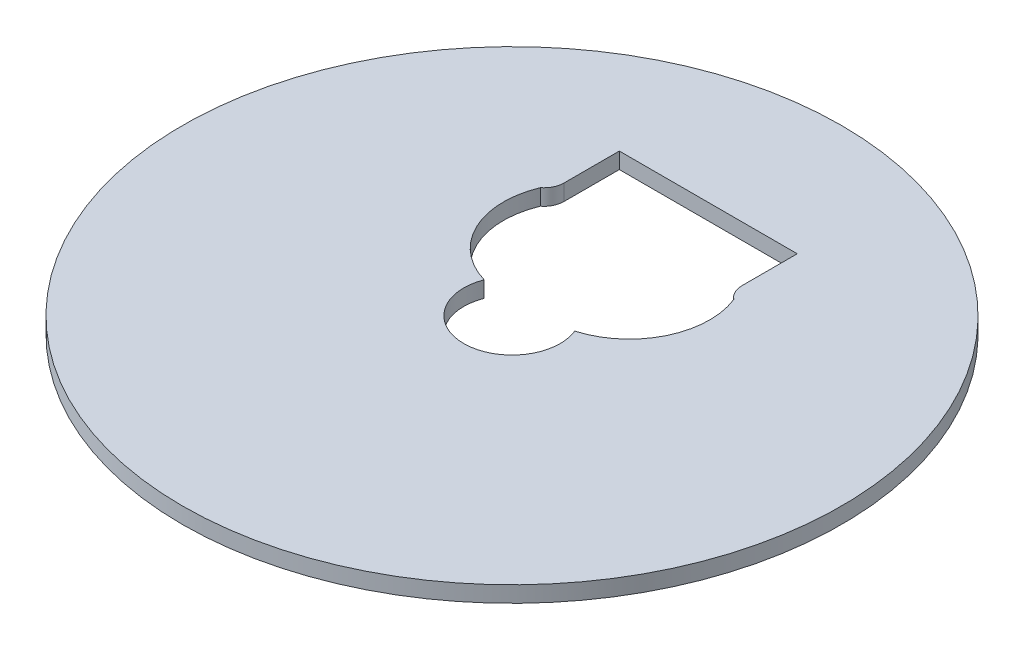
ISO-10303-21;
HEADER;
FILE_DESCRIPTION(('STEP AP214'),'2;1');
FILE_NAME('part.step','',(''),(''),'','','');
FILE_SCHEMA(('AUTOMOTIVE_DESIGN { 1 0 10303 214 1 1 1 1 }'));
ENDSEC;
DATA;
#1=APPLICATION_CONTEXT('core data for automotive mechanical design processes');
#2=APPLICATION_PROTOCOL_DEFINITION('international standard','automotive_design',2000,#1);
#3=PRODUCT_CONTEXT('',#1,'mechanical');
#4=PRODUCT('Part','Part','',(#3));
#5=PRODUCT_RELATED_PRODUCT_CATEGORY('part','',(#4));
#6=PRODUCT_DEFINITION_FORMATION('','',#4);
#7=PRODUCT_DEFINITION_CONTEXT('part definition',#1,'design');
#8=PRODUCT_DEFINITION('design','',#6,#7);
#9=PRODUCT_DEFINITION_SHAPE('','',#8);
#10=(LENGTH_UNIT() NAMED_UNIT(*) SI_UNIT(.MILLI.,.METRE.));
#11=(NAMED_UNIT(*) PLANE_ANGLE_UNIT() SI_UNIT($,.RADIAN.));
#12=(NAMED_UNIT(*) SI_UNIT($,.STERADIAN.) SOLID_ANGLE_UNIT());
#13=UNCERTAINTY_MEASURE_WITH_UNIT(LENGTH_MEASURE(1.E-05),#10,'distance_accuracy_value','');
#14=(GEOMETRIC_REPRESENTATION_CONTEXT(3) GLOBAL_UNCERTAINTY_ASSIGNED_CONTEXT((#13)) GLOBAL_UNIT_ASSIGNED_CONTEXT((#10,
#11,#12)) REPRESENTATION_CONTEXT('',''));
#15=CARTESIAN_POINT('',(0.,0.,0.));
#16=DIRECTION('',(0.,0.,1.));
#17=DIRECTION('',(1.,0.,0.));
#18=AXIS2_PLACEMENT_3D('',#15,#16,#17);
#19=CARTESIAN_POINT('',(-2.53823054176068,2.,-13.7740242069911));
#20=DIRECTION('',(0.,-1.,0.));
#21=DIRECTION('',(0.,0.,-1.));
#22=AXIS2_PLACEMENT_3D('',#19,#20,#21);
#23=CYLINDRICAL_SURFACE('',#22,10.);
#24=CARTESIAN_POINT('',(-2.53823054176068,0.,-13.7740242069911));
#25=DIRECTION('',(0.,1.,0.));
#26=DIRECTION('',(0.,0.,1.));
#27=AXIS2_PLACEMENT_3D('',#24,#25,#26);
#28=CIRCLE('',#27,10.);
#29=CARTESIAN_POINT('',(-5.34780218614919,0.,-4.17682111572293));
#30=VERTEX_POINT('',#29);
#31=CARTESIAN_POINT('',(-11.7774510508071,0.,-17.5998332982532));
#32=VERTEX_POINT('',#31);
#33=EDGE_CURVE('E154',#30,#32,#28,.F.);
#34=ORIENTED_EDGE('',*,*,#33,.T.);
#35=DIRECTION('',(0.,-1.,0.));
#36=VECTOR('',#35,1.);
#37=CARTESIAN_POINT('',(-11.7774510508071,2.,-17.5998332982532));
#38=LINE('',#37,#36);
#39=CARTESIAN_POINT('',(-11.7774510508071,2.,-17.5998332982532));
#40=VERTEX_POINT('',#39);
#41=EDGE_CURVE('E11',#40,#32,#38,.T.);
#42=ORIENTED_EDGE('',*,*,#41,.F.);
#43=CARTESIAN_POINT('',(-2.53823054176068,2.,-13.7740242069911));
#44=DIRECTION('',(0.,1.,0.));
#45=DIRECTION('',(0.,0.,1.));
#46=AXIS2_PLACEMENT_3D('',#43,#44,#45);
#47=CIRCLE('',#46,10.);
#48=CARTESIAN_POINT('',(-5.34780218614919,2.,-4.17682111572293));
#49=VERTEX_POINT('',#48);
#50=EDGE_CURVE('E101',#49,#40,#47,.F.);
#51=ORIENTED_EDGE('',*,*,#50,.F.);
#52=DIRECTION('',(0.,-1.,0.));
#53=VECTOR('',#52,1.);
#54=CARTESIAN_POINT('',(-5.34780218614919,2.,-4.17682111572293));
#55=LINE('',#54,#53);
#56=EDGE_CURVE('E63',#49,#30,#55,.T.);
#57=ORIENTED_EDGE('',*,*,#56,.T.);
#58=EDGE_LOOP('',(#34,#42,#51,#57));
#59=FACE_BOUND('',#58,.T.);
#60=ADVANCED_FACE('F46',(#59),#23,.F.);
#61=CARTESIAN_POINT('',(-13.3089978154866,2.,-19.5757805702824));
#62=DIRECTION('',(0.,-1.,0.));
#63=DIRECTION('',(0.,0.,-1.));
#64=AXIS2_PLACEMENT_3D('',#61,#62,#63);
#65=CYLINDRICAL_SURFACE('',#64,2.5);
#66=CARTESIAN_POINT('',(-13.3089978154866,0.,-19.5757805702824));
#67=DIRECTION('',(0.,1.,0.));
#68=DIRECTION('',(0.,0.,1.));
#69=AXIS2_PLACEMENT_3D('',#66,#67,#68);
#70=CIRCLE('',#69,2.5);
#71=CARTESIAN_POINT('',(-10.8089978154866,0.,-19.5757805702824));
#72=VERTEX_POINT('',#71);
#73=EDGE_CURVE('E157',#72,#32,#70,.F.);
#74=ORIENTED_EDGE('',*,*,#73,.F.);
#75=DIRECTION('',(0.,-1.,0.));
#76=VECTOR('',#75,1.);
#77=CARTESIAN_POINT('',(-10.8089978154866,2.,-19.5757805702824));
#78=LINE('',#77,#76);
#79=CARTESIAN_POINT('',(-10.8089978154866,2.,-19.5757805702824));
#80=VERTEX_POINT('',#79);
#81=EDGE_CURVE('E55',#80,#72,#78,.T.);
#82=ORIENTED_EDGE('',*,*,#81,.F.);
#83=CARTESIAN_POINT('',(-13.3089978154866,2.,-19.5757805702824));
#84=DIRECTION('',(0.,1.,0.));
#85=DIRECTION('',(0.,0.,1.));
#86=AXIS2_PLACEMENT_3D('',#83,#84,#85);
#87=CIRCLE('',#86,2.5);
#88=EDGE_CURVE('E226',#80,#40,#87,.F.);
#89=ORIENTED_EDGE('',*,*,#88,.T.);
#90=ORIENTED_EDGE('',*,*,#41,.T.);
#91=EDGE_LOOP('',(#74,#82,#89,#90));
#92=FACE_BOUND('',#91,.T.);
#93=ADVANCED_FACE('F207',(#92),#65,.T.);
#94=CARTESIAN_POINT('',(-10.8089978154866,2.,0.));
#95=DIRECTION('',(1.,0.,0.));
#96=DIRECTION('',(0.,0.,-1.));
#97=AXIS2_PLACEMENT_3D('',#94,#95,#96);
#98=PLANE('',#97);
#99=DIRECTION('',(0.,0.,1.));
#100=VECTOR('',#99,1.);
#101=CARTESIAN_POINT('',(-10.8089978154866,0.,0.));
#102=LINE('',#101,#100);
#103=CARTESIAN_POINT('',(-10.8089978154866,0.,-26.4576247573257));
#104=VERTEX_POINT('',#103);
#105=EDGE_CURVE('E161',#104,#72,#102,.T.);
#106=ORIENTED_EDGE('',*,*,#105,.F.);
#107=DIRECTION('',(0.,-1.,0.));
#108=VECTOR('',#107,1.);
#109=CARTESIAN_POINT('',(-10.8089978154866,2.,-26.4576247573257));
#110=LINE('',#109,#108);
#111=CARTESIAN_POINT('',(-10.8089978154866,2.,-26.4576247573257));
#112=VERTEX_POINT('',#111);
#113=EDGE_CURVE('E193',#112,#104,#110,.T.);
#114=ORIENTED_EDGE('',*,*,#113,.F.);
#115=DIRECTION('',(0.,0.,1.));
#116=VECTOR('',#115,1.);
#117=CARTESIAN_POINT('',(-10.8089978154866,2.,0.));
#118=LINE('',#117,#116);
#119=EDGE_CURVE('E204',#112,#80,#118,.T.);
#120=ORIENTED_EDGE('',*,*,#119,.T.);
#121=ORIENTED_EDGE('',*,*,#81,.T.);
#122=EDGE_LOOP('',(#106,#114,#120,#121));
#123=FACE_BOUND('',#122,.T.);
#124=ADVANCED_FACE('F202',(#123),#98,.T.);
#125=CARTESIAN_POINT('',(0.,2.,-26.4576247573257));
#126=DIRECTION('',(0.,0.,-1.));
#127=DIRECTION('',(-1.,0.,0.));
#128=AXIS2_PLACEMENT_3D('',#125,#126,#127);
#129=PLANE('',#128);
#130=DIRECTION('',(1.,0.,0.));
#131=VECTOR('',#130,1.);
#132=CARTESIAN_POINT('',(0.,0.,-26.4576247573257));
#133=LINE('',#132,#131);
#134=CARTESIAN_POINT('',(11.3250938001878,0.,-26.4576247573257));
#135=VERTEX_POINT('',#134);
#136=EDGE_CURVE('E165',#104,#135,#133,.T.);
#137=ORIENTED_EDGE('',*,*,#136,.T.);
#138=DIRECTION('',(0.,-1.,0.));
#139=VECTOR('',#138,1.);
#140=CARTESIAN_POINT('',(11.3250938001878,2.,-26.4576247573257));
#141=LINE('',#140,#139);
#142=CARTESIAN_POINT('',(11.3250938001878,2.,-26.4576247573257));
#143=VERTEX_POINT('',#142);
#144=EDGE_CURVE('E189',#143,#135,#141,.T.);
#145=ORIENTED_EDGE('',*,*,#144,.F.);
#146=DIRECTION('',(1.,0.,0.));
#147=VECTOR('',#146,1.);
#148=CARTESIAN_POINT('',(0.,2.,-26.4576247573257));
#149=LINE('',#148,#147);
#150=EDGE_CURVE('E220',#112,#143,#149,.T.);
#151=ORIENTED_EDGE('',*,*,#150,.F.);
#152=ORIENTED_EDGE('',*,*,#113,.T.);
#153=EDGE_LOOP('',(#137,#145,#151,#152));
#154=FACE_BOUND('',#153,.T.);
#155=ADVANCED_FACE('F215',(#154),#129,.F.);
#156=CARTESIAN_POINT('',(11.3250938001878,2.,0.));
#157=DIRECTION('',(1.,0.,0.));
#158=DIRECTION('',(0.,0.,-1.));
#159=AXIS2_PLACEMENT_3D('',#156,#157,#158);
#160=PLANE('',#159);
#161=DIRECTION('',(0.,0.,1.));
#162=VECTOR('',#161,1.);
#163=CARTESIAN_POINT('',(11.3250938001878,0.,0.));
#164=LINE('',#163,#162);
#165=CARTESIAN_POINT('',(11.3250938001878,0.,-19.5757805702824));
#166=VERTEX_POINT('',#165);
#167=EDGE_CURVE('E168',#135,#166,#164,.T.);
#168=ORIENTED_EDGE('',*,*,#167,.T.);
#169=DIRECTION('',(0.,-1.,0.));
#170=VECTOR('',#169,1.);
#171=CARTESIAN_POINT('',(11.3250938001878,2.,-19.5757805702824));
#172=LINE('',#171,#170);
#173=CARTESIAN_POINT('',(11.3250938001878,2.,-19.5757805702824));
#174=VERTEX_POINT('',#173);
#175=EDGE_CURVE('E137',#174,#166,#172,.T.);
#176=ORIENTED_EDGE('',*,*,#175,.F.);
#177=DIRECTION('',(0.,0.,1.));
#178=VECTOR('',#177,1.);
#179=CARTESIAN_POINT('',(11.3250938001878,2.,0.));
#180=LINE('',#179,#178);
#181=EDGE_CURVE('E123',#143,#174,#180,.T.);
#182=ORIENTED_EDGE('',*,*,#181,.F.);
#183=ORIENTED_EDGE('',*,*,#144,.T.);
#184=EDGE_LOOP('',(#168,#176,#182,#183));
#185=FACE_BOUND('',#184,.T.);
#186=ADVANCED_FACE('F218',(#185),#160,.F.);
#187=CARTESIAN_POINT('',(13.8250938001878,2.,-19.5757805702824));
#188=DIRECTION('',(0.,-1.,0.));
#189=DIRECTION('',(0.,0.,-1.));
#190=AXIS2_PLACEMENT_3D('',#187,#188,#189);
#191=CYLINDRICAL_SURFACE('',#190,2.5);
#192=CARTESIAN_POINT('',(13.8250938001878,0.,-19.5757805702824));
#193=DIRECTION('',(0.,1.,0.));
#194=DIRECTION('',(0.,0.,1.));
#195=AXIS2_PLACEMENT_3D('',#192,#193,#194);
#196=CIRCLE('',#195,2.5);
#197=CARTESIAN_POINT('',(12.2954061083367,0.,-17.5983945266886));
#198=VERTEX_POINT('',#197);
#199=EDGE_CURVE('E133',#166,#198,#196,.T.);
#200=ORIENTED_EDGE('',*,*,#199,.T.);
#201=DIRECTION('',(0.,-1.,0.));
#202=VECTOR('',#201,1.);
#203=CARTESIAN_POINT('',(12.2954061083367,2.,-17.5983945266886));
#204=LINE('',#203,#202);
#205=CARTESIAN_POINT('',(12.2954061083367,2.,-17.5983945266886));
#206=VERTEX_POINT('',#205);
#207=EDGE_CURVE('E130',#206,#198,#204,.T.);
#208=ORIENTED_EDGE('',*,*,#207,.F.);
#209=CARTESIAN_POINT('',(13.8250938001878,2.,-19.5757805702824));
#210=DIRECTION('',(0.,1.,0.));
#211=DIRECTION('',(0.,0.,1.));
#212=AXIS2_PLACEMENT_3D('',#209,#210,#211);
#213=CIRCLE('',#212,2.5);
#214=EDGE_CURVE('E116',#174,#206,#213,.T.);
#215=ORIENTED_EDGE('',*,*,#214,.F.);
#216=ORIENTED_EDGE('',*,*,#175,.T.);
#217=EDGE_LOOP('',(#200,#208,#215,#216));
#218=FACE_BOUND('',#217,.T.);
#219=ADVANCED_FACE('F131',(#218),#191,.T.);
#220=CARTESIAN_POINT('',(3.01205565123249,2.,-13.8809485902179));
#221=DIRECTION('',(0.,-1.,0.));
#222=DIRECTION('',(0.,0.,-1.));
#223=AXIS2_PLACEMENT_3D('',#220,#221,#222);
#224=CYLINDRICAL_SURFACE('',#223,10.);
#225=CARTESIAN_POINT('',(3.01205565123249,0.,-13.8809485902179));
#226=DIRECTION('',(0.,1.,0.));
#227=DIRECTION('',(0.,0.,1.));
#228=AXIS2_PLACEMENT_3D('',#225,#226,#227);
#229=CIRCLE('',#228,10.);
#230=CARTESIAN_POINT('',(5.82189493551418,0.,-4.2838238543135));
#231=VERTEX_POINT('',#230);
#232=EDGE_CURVE('E173',#198,#231,#229,.F.);
#233=ORIENTED_EDGE('',*,*,#232,.T.);
#234=DIRECTION('',(0.,-1.,0.));
#235=VECTOR('',#234,1.);
#236=CARTESIAN_POINT('',(5.82189493551418,2.,-4.2838238543135));
#237=LINE('',#236,#235);
#238=CARTESIAN_POINT('',(5.82189493551418,2.,-4.2838238543135));
#239=VERTEX_POINT('',#238);
#240=EDGE_CURVE('E89',#239,#231,#237,.T.);
#241=ORIENTED_EDGE('',*,*,#240,.F.);
#242=CARTESIAN_POINT('',(3.01205565123249,2.,-13.8809485902179));
#243=DIRECTION('',(0.,1.,0.));
#244=DIRECTION('',(0.,0.,1.));
#245=AXIS2_PLACEMENT_3D('',#242,#243,#244);
#246=CIRCLE('',#245,10.);
#247=EDGE_CURVE('E121',#206,#239,#246,.F.);
#248=ORIENTED_EDGE('',*,*,#247,.F.);
#249=ORIENTED_EDGE('',*,*,#207,.T.);
#250=EDGE_LOOP('',(#233,#241,#248,#249));
#251=FACE_BOUND('',#250,.T.);
#252=ADVANCED_FACE('F139',(#251),#224,.F.);
#253=CARTESIAN_POINT('',(0.258047992350575,2.,-2.03802618020102));
#254=DIRECTION('',(0.,-1.,0.));
#255=DIRECTION('',(0.,0.,-1.));
#256=AXIS2_PLACEMENT_3D('',#253,#254,#255);
#257=CYLINDRICAL_SURFACE('',#256,6.);
#258=CARTESIAN_POINT('',(0.258047992350575,0.,-2.03802618020102));
#259=DIRECTION('',(0.,1.,0.));
#260=DIRECTION('',(0.,0.,1.));
#261=AXIS2_PLACEMENT_3D('',#258,#259,#260);
#262=CIRCLE('',#261,6.);
#263=EDGE_CURVE('E176',#30,#231,#262,.T.);
#264=ORIENTED_EDGE('',*,*,#263,.F.);
#265=ORIENTED_EDGE('',*,*,#56,.F.);
#266=CARTESIAN_POINT('',(0.258047992350575,2.,-2.03802618020102));
#267=DIRECTION('',(0.,1.,0.));
#268=DIRECTION('',(0.,0.,1.));
#269=AXIS2_PLACEMENT_3D('',#266,#267,#268);
#270=CIRCLE('',#269,6.);
#271=EDGE_CURVE('E141',#49,#239,#270,.T.);
#272=ORIENTED_EDGE('',*,*,#271,.T.);
#273=ORIENTED_EDGE('',*,*,#240,.T.);
#274=EDGE_LOOP('',(#264,#265,#272,#273));
#275=FACE_BOUND('',#274,.T.);
#276=ADVANCED_FACE('F252',(#275),#257,.F.);
#277=CARTESIAN_POINT('',(0.258047992350575,2.,-2.03802618020102));
#278=DIRECTION('',(0.,-1.,0.));
#279=DIRECTION('',(0.,0.,-1.));
#280=AXIS2_PLACEMENT_3D('',#277,#278,#279);
#281=CYLINDRICAL_SURFACE('',#280,41.);
#282=CARTESIAN_POINT('',(0.258047992350575,2.,-2.03802618020102));
#283=DIRECTION('',(0.,1.,0.));
#284=DIRECTION('',(0.,0.,1.));
#285=AXIS2_PLACEMENT_3D('',#282,#283,#284);
#286=CIRCLE('',#285,41.);
#287=CARTESIAN_POINT('',(0.258047992350575,2.,38.961973819799));
#288=VERTEX_POINT('',#287);
#289=EDGE_CURVE('E147',#288,#288,#286,.T.);
#290=ORIENTED_EDGE('',*,*,#289,.F.);
#291=EDGE_LOOP('',(#290));
#292=FACE_BOUND('',#291,.T.);
#293=CARTESIAN_POINT('',(0.258047992350575,0.,-2.03802618020102));
#294=DIRECTION('',(0.,1.,0.));
#295=DIRECTION('',(0.,0.,1.));
#296=AXIS2_PLACEMENT_3D('',#293,#294,#295);
#297=CIRCLE('',#296,41.);
#298=CARTESIAN_POINT('',(0.258047992350575,0.,38.961973819799));
#299=VERTEX_POINT('',#298);
#300=EDGE_CURVE('E180',#299,#299,#297,.T.);
#301=ORIENTED_EDGE('',*,*,#300,.T.);
#302=EDGE_LOOP('',(#301));
#303=FACE_BOUND('',#302,.T.);
#304=ADVANCED_FACE('F254',(#292,#303),#281,.T.);
#305=CARTESIAN_POINT('',(0.,2.,0.));
#306=DIRECTION('',(0.,1.,0.));
#307=DIRECTION('',(0.,0.,1.));
#308=AXIS2_PLACEMENT_3D('',#305,#306,#307);
#309=PLANE('',#308);
#310=ORIENTED_EDGE('',*,*,#50,.T.);
#311=ORIENTED_EDGE('',*,*,#88,.F.);
#312=ORIENTED_EDGE('',*,*,#119,.F.);
#313=ORIENTED_EDGE('',*,*,#150,.T.);
#314=ORIENTED_EDGE('',*,*,#181,.T.);
#315=ORIENTED_EDGE('',*,*,#214,.T.);
#316=ORIENTED_EDGE('',*,*,#247,.T.);
#317=ORIENTED_EDGE('',*,*,#271,.F.);
#318=EDGE_LOOP('',(#310,#311,#312,#313,#314,#315,#316,#317));
#319=FACE_BOUND('',#318,.T.);
#320=ORIENTED_EDGE('',*,*,#289,.T.);
#321=EDGE_LOOP('',(#320));
#322=FACE_BOUND('',#321,.T.);
#323=ADVANCED_FACE('F118',(#319,#322),#309,.T.);
#324=CARTESIAN_POINT('',(0.,0.,0.));
#325=DIRECTION('',(0.,1.,0.));
#326=DIRECTION('',(0.,0.,1.));
#327=AXIS2_PLACEMENT_3D('',#324,#325,#326);
#328=PLANE('',#327);
#329=ORIENTED_EDGE('',*,*,#33,.F.);
#330=ORIENTED_EDGE('',*,*,#263,.T.);
#331=ORIENTED_EDGE('',*,*,#232,.F.);
#332=ORIENTED_EDGE('',*,*,#199,.F.);
#333=ORIENTED_EDGE('',*,*,#167,.F.);
#334=ORIENTED_EDGE('',*,*,#136,.F.);
#335=ORIENTED_EDGE('',*,*,#105,.T.);
#336=ORIENTED_EDGE('',*,*,#73,.T.);
#337=EDGE_LOOP('',(#329,#330,#331,#332,#333,#334,#335,#336));
#338=FACE_BOUND('',#337,.T.);
#339=ORIENTED_EDGE('',*,*,#300,.F.);
#340=EDGE_LOOP('',(#339));
#341=FACE_BOUND('',#340,.T.);
#342=ADVANCED_FACE('F210',(#338,#341),#328,.F.);
#343=CLOSED_SHELL('',(#60,#93,#124,#155,#186,#219,#252,#276,#304,#323,#342));
#344=MANIFOLD_SOLID_BREP('B2',#343);
#345=ADVANCED_BREP_SHAPE_REPRESENTATION('',(#18,#344),#14);
#346=SHAPE_DEFINITION_REPRESENTATION(#9,#345);
ENDSEC;
END-ISO-10303-21;
